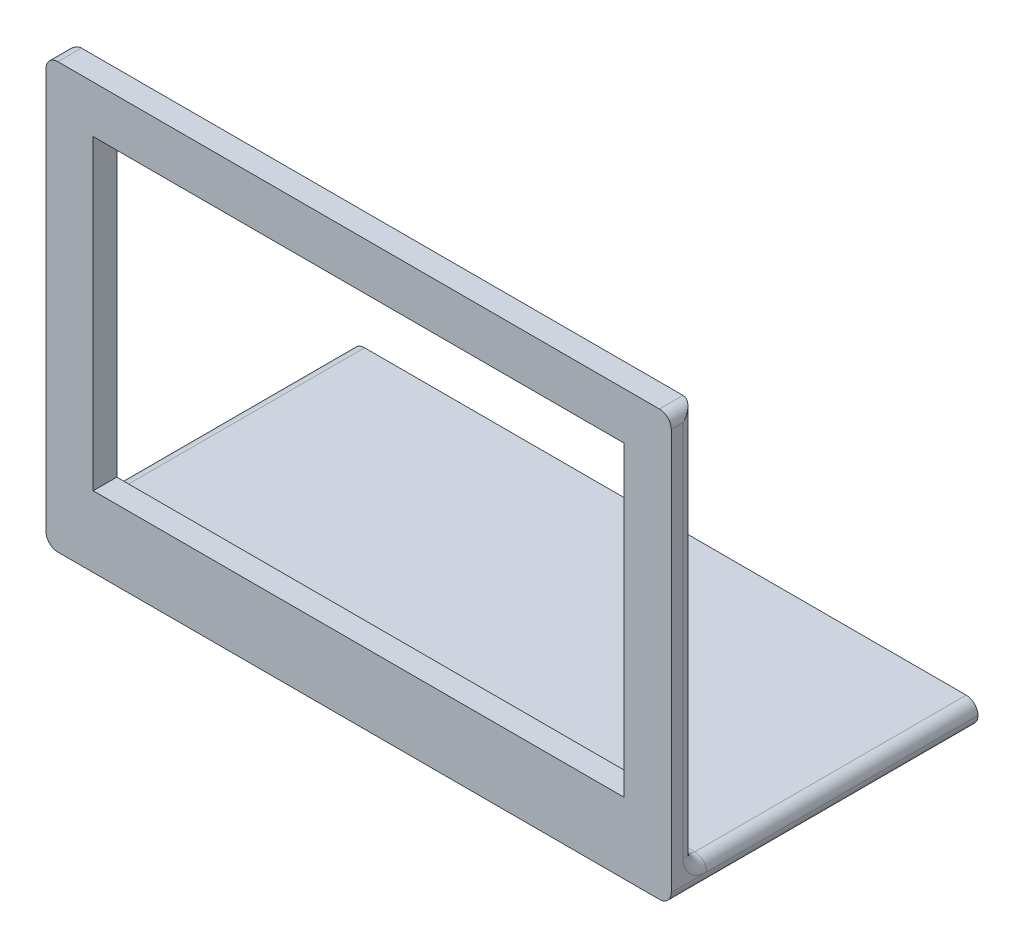
ISO-10303-21;
HEADER;
FILE_DESCRIPTION(('STEP AP214'),'2;1');
FILE_NAME('part.step','',(''),(''),'','','');
FILE_SCHEMA(('AUTOMOTIVE_DESIGN { 1 0 10303 214 1 1 1 1 }'));
ENDSEC;
DATA;
#1=APPLICATION_CONTEXT('core data for automotive mechanical design processes');
#2=APPLICATION_PROTOCOL_DEFINITION('international standard','automotive_design',2000,#1);
#3=PRODUCT_CONTEXT('',#1,'mechanical');
#4=PRODUCT('Part','Part','',(#3));
#5=PRODUCT_RELATED_PRODUCT_CATEGORY('part','',(#4));
#6=PRODUCT_DEFINITION_FORMATION('','',#4);
#7=PRODUCT_DEFINITION_CONTEXT('part definition',#1,'design');
#8=PRODUCT_DEFINITION('design','',#6,#7);
#9=PRODUCT_DEFINITION_SHAPE('','',#8);
#10=(LENGTH_UNIT() NAMED_UNIT(*) SI_UNIT(.MILLI.,.METRE.));
#11=(NAMED_UNIT(*) PLANE_ANGLE_UNIT() SI_UNIT($,.RADIAN.));
#12=(NAMED_UNIT(*) SI_UNIT($,.STERADIAN.) SOLID_ANGLE_UNIT());
#13=UNCERTAINTY_MEASURE_WITH_UNIT(LENGTH_MEASURE(1.E-05),#10,'distance_accuracy_value','');
#14=(GEOMETRIC_REPRESENTATION_CONTEXT(3) GLOBAL_UNCERTAINTY_ASSIGNED_CONTEXT((#13)) GLOBAL_UNIT_ASSIGNED_CONTEXT((#10,
#11,#12)) REPRESENTATION_CONTEXT('',''));
#15=CARTESIAN_POINT('',(0.,0.,0.));
#16=DIRECTION('',(0.,0.,1.));
#17=DIRECTION('',(1.,0.,0.));
#18=AXIS2_PLACEMENT_3D('',#15,#16,#17);
#19=CARTESIAN_POINT('',(0.,0.,0.));
#20=DIRECTION('',(0.,0.,1.));
#21=DIRECTION('',(1.,0.,0.));
#22=AXIS2_PLACEMENT_3D('',#19,#20,#21);
#23=PLANE('',#22);
#24=DIRECTION('',(1.,0.,0.));
#25=VECTOR('',#24,1.);
#26=CARTESIAN_POINT('',(0.,46.8354292599289,0.));
#27=LINE('',#26,#25);
#28=CARTESIAN_POINT('',(-24.7836869346876,46.8354292599289,0.));
#29=VERTEX_POINT('',#28);
#30=CARTESIAN_POINT('',(20.2163130653124,46.8354292599289,0.));
#31=VERTEX_POINT('',#30);
#32=EDGE_CURVE('E182',#29,#31,#27,.T.);
#33=ORIENTED_EDGE('',*,*,#32,.F.);
#34=DIRECTION('',(0.,-1.,0.));
#35=VECTOR('',#34,1.);
#36=CARTESIAN_POINT('',(-24.7836869346877,0.,0.));
#37=LINE('',#36,#35);
#38=CARTESIAN_POINT('',(-24.7836869346876,20.8354292599289,0.));
#39=VERTEX_POINT('',#38);
#40=EDGE_CURVE('E286',#29,#39,#37,.T.);
#41=ORIENTED_EDGE('',*,*,#40,.T.);
#42=DIRECTION('',(1.,0.,0.));
#43=VECTOR('',#42,1.);
#44=CARTESIAN_POINT('',(0.,20.8354292599289,0.));
#45=LINE('',#44,#43);
#46=CARTESIAN_POINT('',(20.2163130653124,20.8354292599289,0.));
#47=VERTEX_POINT('',#46);
#48=EDGE_CURVE('E301',#39,#47,#45,.T.);
#49=ORIENTED_EDGE('',*,*,#48,.T.);
#50=DIRECTION('',(0.,-1.,0.));
#51=VECTOR('',#50,1.);
#52=CARTESIAN_POINT('',(20.2163130653124,0.,0.));
#53=LINE('',#52,#51);
#54=EDGE_CURVE('E299',#31,#47,#53,.T.);
#55=ORIENTED_EDGE('',*,*,#54,.F.);
#56=EDGE_LOOP('',(#33,#41,#49,#55));
#57=FACE_BOUND('',#56,.T.);
#58=DIRECTION('',(1.,0.,0.));
#59=VECTOR('',#58,1.);
#60=CARTESIAN_POINT('',(-28.7836869346876,17.8354292599289,0.));
#61=LINE('',#60,#59);
#62=CARTESIAN_POINT('',(23.2163130653124,17.8354292599289,0.));
#63=VERTEX_POINT('',#62);
#64=CARTESIAN_POINT('',(-27.7836869346876,17.8354292599289,0.));
#65=VERTEX_POINT('',#64);
#66=EDGE_CURVE('E183',#63,#65,#61,.F.);
#67=ORIENTED_EDGE('',*,*,#66,.T.);
#68=DIRECTION('',(0.,1.,0.));
#69=VECTOR('',#68,1.);
#70=CARTESIAN_POINT('',(-27.7836869346876,50.8354292599289,0.));
#71=LINE('',#70,#69);
#72=CARTESIAN_POINT('',(-27.7836869346876,50.8354292599289,0.));
#73=VERTEX_POINT('',#72);
#74=EDGE_CURVE('E192',#65,#73,#71,.T.);
#75=ORIENTED_EDGE('',*,*,#74,.T.);
#76=DIRECTION('',(1.,0.,0.));
#77=VECTOR('',#76,1.);
#78=CARTESIAN_POINT('',(0.,50.8354292599289,0.));
#79=LINE('',#78,#77);
#80=CARTESIAN_POINT('',(23.2163130653127,50.8354292599289,0.));
#81=VERTEX_POINT('',#80);
#82=EDGE_CURVE('E279',#73,#81,#79,.T.);
#83=ORIENTED_EDGE('',*,*,#82,.T.);
#84=DIRECTION('',(0.,-1.,0.));
#85=VECTOR('',#84,1.);
#86=CARTESIAN_POINT('',(23.2163130653124,16.8354292599289,0.));
#87=LINE('',#86,#85);
#88=EDGE_CURVE('E185',#81,#63,#87,.T.);
#89=ORIENTED_EDGE('',*,*,#88,.T.);
#90=EDGE_LOOP('',(#67,#75,#83,#89));
#91=FACE_BOUND('',#90,.T.);
#92=ADVANCED_FACE('F37',(#57,#91),#23,.F.);
#93=CARTESIAN_POINT('',(0.,46.8354292599289,2.));
#94=DIRECTION('',(0.,1.,0.));
#95=DIRECTION('',(0.,0.,1.));
#96=AXIS2_PLACEMENT_3D('',#93,#94,#95);
#97=PLANE('',#96);
#98=ORIENTED_EDGE('',*,*,#32,.T.);
#99=DIRECTION('',(0.,0.,-1.));
#100=VECTOR('',#99,1.);
#101=CARTESIAN_POINT('',(20.2163130653124,46.8354292599289,2.));
#102=LINE('',#101,#100);
#103=CARTESIAN_POINT('',(20.2163130653124,46.8354292599289,2.));
#104=VERTEX_POINT('',#103);
#105=EDGE_CURVE('E163',#104,#31,#102,.T.);
#106=ORIENTED_EDGE('',*,*,#105,.F.);
#107=DIRECTION('',(1.,0.,0.));
#108=VECTOR('',#107,1.);
#109=CARTESIAN_POINT('',(0.,46.8354292599289,2.));
#110=LINE('',#109,#108);
#111=CARTESIAN_POINT('',(-24.7836869346876,46.8354292599289,2.));
#112=VERTEX_POINT('',#111);
#113=EDGE_CURVE('E170',#112,#104,#110,.T.);
#114=ORIENTED_EDGE('',*,*,#113,.F.);
#115=DIRECTION('',(0.,0.,-1.));
#116=VECTOR('',#115,1.);
#117=CARTESIAN_POINT('',(-24.7836869346876,46.8354292599289,2.));
#118=LINE('',#117,#116);
#119=EDGE_CURVE('E295',#112,#29,#118,.T.);
#120=ORIENTED_EDGE('',*,*,#119,.T.);
#121=EDGE_LOOP('',(#98,#106,#114,#120));
#122=FACE_BOUND('',#121,.T.);
#123=ADVANCED_FACE('F180',(#122),#97,.F.);
#124=CARTESIAN_POINT('',(20.2163130653124,0.,2.));
#125=DIRECTION('',(1.,0.,0.));
#126=DIRECTION('',(0.,0.,-1.));
#127=AXIS2_PLACEMENT_3D('',#124,#125,#126);
#128=PLANE('',#127);
#129=ORIENTED_EDGE('',*,*,#54,.T.);
#130=DIRECTION('',(0.,0.,-1.));
#131=VECTOR('',#130,1.);
#132=CARTESIAN_POINT('',(20.2163130653124,20.8354292599289,2.));
#133=LINE('',#132,#131);
#134=CARTESIAN_POINT('',(20.2163130653124,20.8354292599289,2.));
#135=VERTEX_POINT('',#134);
#136=EDGE_CURVE('E165',#135,#47,#133,.T.);
#137=ORIENTED_EDGE('',*,*,#136,.F.);
#138=DIRECTION('',(0.,-1.,0.));
#139=VECTOR('',#138,1.);
#140=CARTESIAN_POINT('',(20.2163130653124,0.,2.));
#141=LINE('',#140,#139);
#142=EDGE_CURVE('E158',#104,#135,#141,.T.);
#143=ORIENTED_EDGE('',*,*,#142,.F.);
#144=ORIENTED_EDGE('',*,*,#105,.T.);
#145=EDGE_LOOP('',(#129,#137,#143,#144));
#146=FACE_BOUND('',#145,.T.);
#147=ADVANCED_FACE('F161',(#146),#128,.F.);
#148=CARTESIAN_POINT('',(0.,20.8354292599289,2.));
#149=DIRECTION('',(0.,1.,0.));
#150=DIRECTION('',(0.,0.,1.));
#151=AXIS2_PLACEMENT_3D('',#148,#149,#150);
#152=PLANE('',#151);
#153=ORIENTED_EDGE('',*,*,#48,.F.);
#154=DIRECTION('',(0.,0.,-1.));
#155=VECTOR('',#154,1.);
#156=CARTESIAN_POINT('',(-24.7836869346876,20.8354292599289,2.));
#157=LINE('',#156,#155);
#158=CARTESIAN_POINT('',(-24.7836869346876,20.8354292599289,2.));
#159=VERTEX_POINT('',#158);
#160=EDGE_CURVE('E187',#159,#39,#157,.T.);
#161=ORIENTED_EDGE('',*,*,#160,.F.);
#162=DIRECTION('',(1.,0.,0.));
#163=VECTOR('',#162,1.);
#164=CARTESIAN_POINT('',(0.,20.8354292599289,2.));
#165=LINE('',#164,#163);
#166=EDGE_CURVE('E169',#159,#135,#165,.T.);
#167=ORIENTED_EDGE('',*,*,#166,.T.);
#168=ORIENTED_EDGE('',*,*,#136,.T.);
#169=EDGE_LOOP('',(#153,#161,#167,#168));
#170=FACE_BOUND('',#169,.T.);
#171=ADVANCED_FACE('F311',(#170),#152,.T.);
#172=CARTESIAN_POINT('',(-28.7836869346877,0.,2.));
#173=DIRECTION('',(-1.,0.,0.));
#174=DIRECTION('',(0.,-1.,0.));
#175=AXIS2_PLACEMENT_3D('',#172,#173,#174);
#176=PLANE('',#175);
#177=DIRECTION('',(0.,1.,0.));
#178=VECTOR('',#177,1.);
#179=CARTESIAN_POINT('',(-28.7836869346877,0.,2.));
#180=LINE('',#179,#178);
#181=CARTESIAN_POINT('',(-28.7836869346876,15.8354292599289,2.));
#182=VERTEX_POINT('',#181);
#183=CARTESIAN_POINT('',(-28.7836869346876,49.8354292599289,2.));
#184=VERTEX_POINT('',#183);
#185=EDGE_CURVE('E282',#182,#184,#180,.T.);
#186=ORIENTED_EDGE('',*,*,#185,.T.);
#187=DIRECTION('',(0.,0.,-1.));
#188=VECTOR('',#187,1.);
#189=CARTESIAN_POINT('',(-28.7836869346876,49.8354292599289,2.));
#190=LINE('',#189,#188);
#191=CARTESIAN_POINT('',(-28.7836869346876,49.8354292599289,1.));
#192=VERTEX_POINT('',#191);
#193=EDGE_CURVE('E202',#184,#192,#190,.T.);
#194=ORIENTED_EDGE('',*,*,#193,.T.);
#195=DIRECTION('',(0.,1.,0.));
#196=VECTOR('',#195,1.);
#197=CARTESIAN_POINT('',(-28.7836869346876,16.8354292599289,1.));
#198=LINE('',#197,#196);
#199=CARTESIAN_POINT('',(-28.7836869346876,17.8354292599289,1.));
#200=VERTEX_POINT('',#199);
#201=EDGE_CURVE('E200',#192,#200,#198,.F.);
#202=ORIENTED_EDGE('',*,*,#201,.T.);
#203=CARTESIAN_POINT('',(-28.7836869346876,17.8354292599289,-1.));
#204=DIRECTION('',(-1.,0.,0.));
#205=DIRECTION('',(0.,-1.,0.));
#206=AXIS2_PLACEMENT_3D('',#203,#204,#205);
#207=CIRCLE('',#206,2.);
#208=CARTESIAN_POINT('',(-28.7836869346876,15.8354292599289,-1.));
#209=VERTEX_POINT('',#208);
#210=EDGE_CURVE('E197',#209,#200,#207,.T.);
#211=ORIENTED_EDGE('',*,*,#210,.F.);
#212=DIRECTION('',(0.,0.,-1.));
#213=VECTOR('',#212,1.);
#214=CARTESIAN_POINT('',(-28.7836869346876,15.8354292599289,2.));
#215=LINE('',#214,#213);
#216=EDGE_CURVE('E195',#209,#182,#215,.F.);
#217=ORIENTED_EDGE('',*,*,#216,.T.);
#218=EDGE_LOOP('',(#186,#194,#202,#211,#217));
#219=FACE_BOUND('',#218,.T.);
#220=ADVANCED_FACE('F367',(#219),#176,.T.);
#221=CARTESIAN_POINT('',(0.,14.8354292599289,2.));
#222=DIRECTION('',(0.,-1.,0.));
#223=DIRECTION('',(1.,0.,0.));
#224=AXIS2_PLACEMENT_3D('',#221,#222,#223);
#225=PLANE('',#224);
#226=DIRECTION('',(-1.,0.,0.));
#227=VECTOR('',#226,1.);
#228=CARTESIAN_POINT('',(0.,14.8354292599289,-24.));
#229=LINE('',#228,#227);
#230=CARTESIAN_POINT('',(23.2163130653124,14.8354292599289,-24.));
#231=VERTEX_POINT('',#230);
#232=CARTESIAN_POINT('',(-27.7836869346876,14.8354292599289,-24.));
#233=VERTEX_POINT('',#232);
#234=EDGE_CURVE('E268',#231,#233,#229,.T.);
#235=ORIENTED_EDGE('',*,*,#234,.F.);
#236=DIRECTION('',(0.,0.,-1.));
#237=VECTOR('',#236,1.);
#238=CARTESIAN_POINT('',(23.2163130653124,14.8354292599289,2.));
#239=LINE('',#238,#237);
#240=CARTESIAN_POINT('',(23.2163130653124,14.8354292599289,2.));
#241=VERTEX_POINT('',#240);
#242=EDGE_CURVE('E11',#231,#241,#239,.F.);
#243=ORIENTED_EDGE('',*,*,#242,.T.);
#244=DIRECTION('',(-1.,0.,0.));
#245=VECTOR('',#244,1.);
#246=CARTESIAN_POINT('',(0.,14.8354292599289,2.));
#247=LINE('',#246,#245);
#248=CARTESIAN_POINT('',(-27.7836869346876,14.8354292599289,2.));
#249=VERTEX_POINT('',#248);
#250=EDGE_CURVE('E285',#241,#249,#247,.T.);
#251=ORIENTED_EDGE('',*,*,#250,.T.);
#252=DIRECTION('',(0.,0.,-1.));
#253=VECTOR('',#252,1.);
#254=CARTESIAN_POINT('',(-27.7836869346876,14.8354292599289,2.));
#255=LINE('',#254,#253);
#256=EDGE_CURVE('E46',#249,#233,#255,.T.);
#257=ORIENTED_EDGE('',*,*,#256,.T.);
#258=EDGE_LOOP('',(#235,#243,#251,#257));
#259=FACE_BOUND('',#258,.T.);
#260=ADVANCED_FACE('F369',(#259),#225,.T.);
#261=CARTESIAN_POINT('',(24.2163130653122,-2.52051640656006E-13,2.));
#262=DIRECTION('',(1.,0.,0.));
#263=DIRECTION('',(0.,1.,0.));
#264=AXIS2_PLACEMENT_3D('',#261,#262,#263);
#265=PLANE('',#264);
#266=DIRECTION('',(0.,-1.,0.));
#267=VECTOR('',#266,1.);
#268=CARTESIAN_POINT('',(24.2163130653127,50.8354292599289,1.));
#269=LINE('',#268,#267);
#270=CARTESIAN_POINT('',(24.2163130653124,17.8354292599289,1.));
#271=VERTEX_POINT('',#270);
#272=CARTESIAN_POINT('',(24.2163130653127,49.8354292599289,1.));
#273=VERTEX_POINT('',#272);
#274=EDGE_CURVE('E209',#271,#273,#269,.F.);
#275=ORIENTED_EDGE('',*,*,#274,.T.);
#276=DIRECTION('',(0.,0.,-1.));
#277=VECTOR('',#276,1.);
#278=CARTESIAN_POINT('',(24.2163130653127,49.8354292599289,2.));
#279=LINE('',#278,#277);
#280=CARTESIAN_POINT('',(24.2163130653127,49.8354292599289,2.));
#281=VERTEX_POINT('',#280);
#282=EDGE_CURVE('E211',#273,#281,#279,.F.);
#283=ORIENTED_EDGE('',*,*,#282,.T.);
#284=DIRECTION('',(0.,-1.,0.));
#285=VECTOR('',#284,1.);
#286=CARTESIAN_POINT('',(24.2163130653122,-2.52051640656006E-13,2.));
#287=LINE('',#286,#285);
#288=CARTESIAN_POINT('',(24.2163130653124,15.8354292599289,2.));
#289=VERTEX_POINT('',#288);
#290=EDGE_CURVE('E288',#281,#289,#287,.T.);
#291=ORIENTED_EDGE('',*,*,#290,.T.);
#292=DIRECTION('',(0.,0.,-1.));
#293=VECTOR('',#292,1.);
#294=CARTESIAN_POINT('',(24.2163130653124,15.8354292599289,2.));
#295=LINE('',#294,#293);
#296=CARTESIAN_POINT('',(24.2163130653124,15.8354292599289,-1.));
#297=VERTEX_POINT('',#296);
#298=EDGE_CURVE('E204',#289,#297,#295,.T.);
#299=ORIENTED_EDGE('',*,*,#298,.T.);
#300=CARTESIAN_POINT('',(24.2163130653124,17.8354292599289,-1.));
#301=DIRECTION('',(1.,0.,0.));
#302=DIRECTION('',(0.,1.,0.));
#303=AXIS2_PLACEMENT_3D('',#300,#301,#302);
#304=CIRCLE('',#303,2.);
#305=EDGE_CURVE('E206',#271,#297,#304,.T.);
#306=ORIENTED_EDGE('',*,*,#305,.F.);
#307=EDGE_LOOP('',(#275,#283,#291,#299,#306));
#308=FACE_BOUND('',#307,.T.);
#309=ADVANCED_FACE('F375',(#308),#265,.T.);
#310=CARTESIAN_POINT('',(0.,50.8354292599289,2.));
#311=DIRECTION('',(0.,1.,0.));
#312=DIRECTION('',(0.,0.,1.));
#313=AXIS2_PLACEMENT_3D('',#310,#311,#312);
#314=PLANE('',#313);
#315=DIRECTION('',(1.,0.,0.));
#316=VECTOR('',#315,1.);
#317=CARTESIAN_POINT('',(0.,50.8354292599289,2.));
#318=LINE('',#317,#316);
#319=CARTESIAN_POINT('',(-27.7836869346876,50.8354292599289,2.));
#320=VERTEX_POINT('',#319);
#321=CARTESIAN_POINT('',(23.2163130653127,50.8354292599289,2.));
#322=VERTEX_POINT('',#321);
#323=EDGE_CURVE('E178',#320,#322,#318,.T.);
#324=ORIENTED_EDGE('',*,*,#323,.T.);
#325=DIRECTION('',(0.,0.,-1.));
#326=VECTOR('',#325,1.);
#327=CARTESIAN_POINT('',(23.2163130653127,50.8354292599289,2.));
#328=LINE('',#327,#326);
#329=EDGE_CURVE('E229',#322,#81,#328,.T.);
#330=ORIENTED_EDGE('',*,*,#329,.T.);
#331=ORIENTED_EDGE('',*,*,#82,.F.);
#332=DIRECTION('',(0.,0.,-1.));
#333=VECTOR('',#332,1.);
#334=CARTESIAN_POINT('',(-27.7836869346876,50.8354292599289,2.));
#335=LINE('',#334,#333);
#336=EDGE_CURVE('E227',#73,#320,#335,.F.);
#337=ORIENTED_EDGE('',*,*,#336,.T.);
#338=EDGE_LOOP('',(#324,#330,#331,#337));
#339=FACE_BOUND('',#338,.T.);
#340=ADVANCED_FACE('F339',(#339),#314,.T.);
#341=CARTESIAN_POINT('',(-24.7836869346877,0.,2.));
#342=DIRECTION('',(1.,0.,0.));
#343=DIRECTION('',(0.,1.,0.));
#344=AXIS2_PLACEMENT_3D('',#341,#342,#343);
#345=PLANE('',#344);
#346=ORIENTED_EDGE('',*,*,#40,.F.);
#347=ORIENTED_EDGE('',*,*,#119,.F.);
#348=DIRECTION('',(0.,-1.,0.));
#349=VECTOR('',#348,1.);
#350=CARTESIAN_POINT('',(-24.7836869346877,0.,2.));
#351=LINE('',#350,#349);
#352=EDGE_CURVE('E176',#112,#159,#351,.T.);
#353=ORIENTED_EDGE('',*,*,#352,.T.);
#354=ORIENTED_EDGE('',*,*,#160,.T.);
#355=EDGE_LOOP('',(#346,#347,#353,#354));
#356=FACE_BOUND('',#355,.T.);
#357=ADVANCED_FACE('F309',(#356),#345,.T.);
#358=CARTESIAN_POINT('',(0.,0.,2.));
#359=DIRECTION('',(0.,0.,1.));
#360=DIRECTION('',(1.,0.,0.));
#361=AXIS2_PLACEMENT_3D('',#358,#359,#360);
#362=PLANE('',#361);
#363=ORIENTED_EDGE('',*,*,#290,.F.);
#364=CARTESIAN_POINT('',(23.2163130653127,49.8354292599289,2.));
#365=DIRECTION('',(0.,0.,1.));
#366=DIRECTION('',(1.,0.,0.));
#367=AXIS2_PLACEMENT_3D('',#364,#365,#366);
#368=CIRCLE('',#367,1.);
#369=EDGE_CURVE('E236',#281,#322,#368,.T.);
#370=ORIENTED_EDGE('',*,*,#369,.T.);
#371=ORIENTED_EDGE('',*,*,#323,.F.);
#372=CARTESIAN_POINT('',(-27.7836869346876,49.8354292599289,2.));
#373=DIRECTION('',(0.,0.,1.));
#374=DIRECTION('',(1.,0.,0.));
#375=AXIS2_PLACEMENT_3D('',#372,#373,#374);
#376=CIRCLE('',#375,1.);
#377=EDGE_CURVE('E232',#320,#184,#376,.T.);
#378=ORIENTED_EDGE('',*,*,#377,.T.);
#379=ORIENTED_EDGE('',*,*,#185,.F.);
#380=CARTESIAN_POINT('',(-27.7836869346876,15.8354292599289,2.));
#381=DIRECTION('',(0.,0.,1.));
#382=DIRECTION('',(1.,0.,0.));
#383=AXIS2_PLACEMENT_3D('',#380,#381,#382);
#384=CIRCLE('',#383,1.);
#385=EDGE_CURVE('E54',#182,#249,#384,.T.);
#386=ORIENTED_EDGE('',*,*,#385,.T.);
#387=ORIENTED_EDGE('',*,*,#250,.F.);
#388=CARTESIAN_POINT('',(23.2163130653124,15.8354292599289,2.));
#389=DIRECTION('',(0.,0.,1.));
#390=DIRECTION('',(1.,0.,0.));
#391=AXIS2_PLACEMENT_3D('',#388,#389,#390);
#392=CIRCLE('',#391,1.);
#393=EDGE_CURVE('E234',#241,#289,#392,.T.);
#394=ORIENTED_EDGE('',*,*,#393,.T.);
#395=EDGE_LOOP('',(#363,#370,#371,#378,#379,#386,#387,#394));
#396=FACE_BOUND('',#395,.T.);
#397=ORIENTED_EDGE('',*,*,#113,.T.);
#398=ORIENTED_EDGE('',*,*,#142,.T.);
#399=ORIENTED_EDGE('',*,*,#166,.F.);
#400=ORIENTED_EDGE('',*,*,#352,.F.);
#401=EDGE_LOOP('',(#397,#398,#399,#400));
#402=FACE_BOUND('',#401,.T.);
#403=ADVANCED_FACE('F174',(#396,#402),#362,.T.);
#404=CARTESIAN_POINT('',(0.,16.8354292599289,-24.));
#405=DIRECTION('',(0.,-1.,0.));
#406=DIRECTION('',(0.,0.,-1.));
#407=AXIS2_PLACEMENT_3D('',#404,#405,#406);
#408=PLANE('',#407);
#409=DIRECTION('',(1.,0.,0.));
#410=VECTOR('',#409,1.);
#411=CARTESIAN_POINT('',(0.,16.8354292599289,-24.));
#412=LINE('',#411,#410);
#413=CARTESIAN_POINT('',(-27.7836869346876,16.8354292599289,-24.));
#414=VERTEX_POINT('',#413);
#415=CARTESIAN_POINT('',(23.2163130653124,16.8354292599289,-24.));
#416=VERTEX_POINT('',#415);
#417=EDGE_CURVE('E274',#414,#416,#412,.T.);
#418=ORIENTED_EDGE('',*,*,#417,.F.);
#419=DIRECTION('',(0.,0.,1.));
#420=VECTOR('',#419,1.);
#421=CARTESIAN_POINT('',(-27.7836869346876,16.8354292599289,0.));
#422=LINE('',#421,#420);
#423=CARTESIAN_POINT('',(-27.7836869346876,16.8354292599289,-1.));
#424=VERTEX_POINT('',#423);
#425=EDGE_CURVE('E217',#414,#424,#422,.T.);
#426=ORIENTED_EDGE('',*,*,#425,.T.);
#427=DIRECTION('',(1.,0.,0.));
#428=VECTOR('',#427,1.);
#429=CARTESIAN_POINT('',(24.2163130653124,16.8354292599289,-1.));
#430=LINE('',#429,#428);
#431=CARTESIAN_POINT('',(23.2163130653124,16.8354292599289,-1.));
#432=VERTEX_POINT('',#431);
#433=EDGE_CURVE('E215',#424,#432,#430,.T.);
#434=ORIENTED_EDGE('',*,*,#433,.T.);
#435=DIRECTION('',(0.,0.,1.));
#436=VECTOR('',#435,1.);
#437=CARTESIAN_POINT('',(23.2163130653124,16.8354292599289,-24.));
#438=LINE('',#437,#436);
#439=EDGE_CURVE('E213',#432,#416,#438,.F.);
#440=ORIENTED_EDGE('',*,*,#439,.T.);
#441=EDGE_LOOP('',(#418,#426,#434,#440));
#442=FACE_BOUND('',#441,.T.);
#443=ADVANCED_FACE('F354',(#442),#408,.F.);
#444=CARTESIAN_POINT('',(0.,0.,-24.));
#445=DIRECTION('',(0.,0.,1.));
#446=DIRECTION('',(1.,0.,0.));
#447=AXIS2_PLACEMENT_3D('',#444,#445,#446);
#448=PLANE('',#447);
#449=ORIENTED_EDGE('',*,*,#417,.T.);
#450=CARTESIAN_POINT('',(23.2163130653124,15.8354292599289,-24.));
#451=DIRECTION('',(0.,0.,1.));
#452=DIRECTION('',(1.,0.,0.));
#453=AXIS2_PLACEMENT_3D('',#450,#451,#452);
#454=CIRCLE('',#453,1.);
#455=CARTESIAN_POINT('',(24.2163130653124,15.8354292599289,-24.));
#456=VERTEX_POINT('',#455);
#457=EDGE_CURVE('E225',#416,#456,#454,.F.);
#458=ORIENTED_EDGE('',*,*,#457,.T.);
#459=CARTESIAN_POINT('',(23.2163130653124,15.8354292599289,-24.));
#460=DIRECTION('',(0.,0.,1.));
#461=DIRECTION('',(1.,0.,0.));
#462=AXIS2_PLACEMENT_3D('',#459,#460,#461);
#463=CIRCLE('',#462,1.);
#464=EDGE_CURVE('E223',#456,#231,#463,.F.);
#465=ORIENTED_EDGE('',*,*,#464,.T.);
#466=ORIENTED_EDGE('',*,*,#234,.T.);
#467=CARTESIAN_POINT('',(-27.7836869346876,15.8354292599289,-24.));
#468=DIRECTION('',(0.,0.,1.));
#469=DIRECTION('',(1.,0.,0.));
#470=AXIS2_PLACEMENT_3D('',#467,#468,#469);
#471=CIRCLE('',#470,1.);
#472=CARTESIAN_POINT('',(-28.7836869346876,15.8354292599289,-24.));
#473=VERTEX_POINT('',#472);
#474=EDGE_CURVE('E219',#233,#473,#471,.F.);
#475=ORIENTED_EDGE('',*,*,#474,.T.);
#476=CARTESIAN_POINT('',(-27.7836869346876,15.8354292599289,-24.));
#477=DIRECTION('',(0.,0.,1.));
#478=DIRECTION('',(1.,0.,0.));
#479=AXIS2_PLACEMENT_3D('',#476,#477,#478);
#480=CIRCLE('',#479,1.);
#481=EDGE_CURVE('E221',#473,#414,#480,.F.);
#482=ORIENTED_EDGE('',*,*,#481,.T.);
#483=EDGE_LOOP('',(#449,#458,#465,#466,#475,#482));
#484=FACE_BOUND('',#483,.T.);
#485=ADVANCED_FACE('F356',(#484),#448,.F.);
#486=CARTESIAN_POINT('',(23.2163130653124,15.8354292599289,2.));
#487=DIRECTION('',(0.,0.,-1.));
#488=DIRECTION('',(-1.,0.,0.));
#489=AXIS2_PLACEMENT_3D('',#486,#487,#488);
#490=CYLINDRICAL_SURFACE('',#489,1.);
#491=ORIENTED_EDGE('',*,*,#242,.F.);
#492=ORIENTED_EDGE('',*,*,#464,.F.);
#493=DIRECTION('',(0.,0.,-1.));
#494=VECTOR('',#493,1.);
#495=CARTESIAN_POINT('',(24.2163130653124,15.8354292599289,2.));
#496=LINE('',#495,#494);
#497=EDGE_CURVE('E41',#297,#456,#496,.T.);
#498=ORIENTED_EDGE('',*,*,#497,.F.);
#499=ORIENTED_EDGE('',*,*,#298,.F.);
#500=ORIENTED_EDGE('',*,*,#393,.F.);
#501=EDGE_LOOP('',(#491,#492,#498,#499,#500));
#502=FACE_BOUND('',#501,.T.);
#503=ADVANCED_FACE('F39',(#502),#490,.T.);
#504=CARTESIAN_POINT('',(23.2163130653127,49.8354292599289,2.));
#505=DIRECTION('',(0.,0.,-1.));
#506=DIRECTION('',(-1.,0.,0.));
#507=AXIS2_PLACEMENT_3D('',#504,#505,#506);
#508=CYLINDRICAL_SURFACE('',#507,1.);
#509=ORIENTED_EDGE('',*,*,#369,.F.);
#510=ORIENTED_EDGE('',*,*,#282,.F.);
#511=CARTESIAN_POINT('',(23.2163130653127,49.8354292599289,1.));
#512=DIRECTION('',(0.,-0.707106781186547,-0.707106781186547));
#513=DIRECTION('',(0.,0.707106781186547,-0.707106781186547));
#514=AXIS2_PLACEMENT_3D('',#511,#512,#513);
#515=ELLIPSE('',#514,1.41421356237309,1.);
#516=EDGE_CURVE('E261',#81,#273,#515,.T.);
#517=ORIENTED_EDGE('',*,*,#516,.F.);
#518=ORIENTED_EDGE('',*,*,#329,.F.);
#519=EDGE_LOOP('',(#509,#510,#517,#518));
#520=FACE_BOUND('',#519,.T.);
#521=ADVANCED_FACE('F345',(#520),#508,.T.);
#522=CARTESIAN_POINT('',(23.2163130653124,15.8354292599289,2.));
#523=DIRECTION('',(0.,0.,-1.));
#524=DIRECTION('',(-1.,0.,0.));
#525=AXIS2_PLACEMENT_3D('',#522,#523,#524);
#526=CYLINDRICAL_SURFACE('',#525,1.);
#527=ORIENTED_EDGE('',*,*,#457,.F.);
#528=ORIENTED_EDGE('',*,*,#439,.F.);
#529=CARTESIAN_POINT('',(23.2163130653124,15.8354292599289,-1.));
#530=DIRECTION('',(0.,0.,1.));
#531=DIRECTION('',(1.,0.,0.));
#532=AXIS2_PLACEMENT_3D('',#529,#530,#531);
#533=CIRCLE('',#532,1.);
#534=EDGE_CURVE('E259',#297,#432,#533,.T.);
#535=ORIENTED_EDGE('',*,*,#534,.F.);
#536=ORIENTED_EDGE('',*,*,#497,.T.);
#537=EDGE_LOOP('',(#527,#528,#535,#536));
#538=FACE_BOUND('',#537,.T.);
#539=ADVANCED_FACE('F351',(#538),#526,.T.);
#540=CARTESIAN_POINT('',(23.2163130653122,-2.41643299800146E-13,1.));
#541=DIRECTION('',(0.,1.,0.));
#542=DIRECTION('',(-1.,0.,0.));
#543=AXIS2_PLACEMENT_3D('',#540,#541,#542);
#544=CYLINDRICAL_SURFACE('',#543,1.);
#545=ORIENTED_EDGE('',*,*,#516,.T.);
#546=ORIENTED_EDGE('',*,*,#274,.F.);
#547=CARTESIAN_POINT('',(23.2163130653124,17.8354292599289,1.));
#548=DIRECTION('',(0.,-1.,0.));
#549=DIRECTION('',(1.,0.,0.));
#550=AXIS2_PLACEMENT_3D('',#547,#548,#549);
#551=CIRCLE('',#550,1.);
#552=EDGE_CURVE('E256',#63,#271,#551,.T.);
#553=ORIENTED_EDGE('',*,*,#552,.F.);
#554=ORIENTED_EDGE('',*,*,#88,.F.);
#555=EDGE_LOOP('',(#545,#546,#553,#554));
#556=FACE_BOUND('',#555,.T.);
#557=ADVANCED_FACE('F346',(#556),#544,.T.);
#558=CARTESIAN_POINT('',(-27.7836869346876,15.8354292599289,2.));
#559=DIRECTION('',(0.,0.,-1.));
#560=DIRECTION('',(-1.,0.,0.));
#561=AXIS2_PLACEMENT_3D('',#558,#559,#560);
#562=CYLINDRICAL_SURFACE('',#561,1.);
#563=ORIENTED_EDGE('',*,*,#385,.F.);
#564=ORIENTED_EDGE('',*,*,#216,.F.);
#565=DIRECTION('',(0.,0.,-1.));
#566=VECTOR('',#565,1.);
#567=CARTESIAN_POINT('',(-28.7836869346876,15.8354292599289,2.));
#568=LINE('',#567,#566);
#569=EDGE_CURVE('E253',#473,#209,#568,.F.);
#570=ORIENTED_EDGE('',*,*,#569,.F.);
#571=ORIENTED_EDGE('',*,*,#474,.F.);
#572=ORIENTED_EDGE('',*,*,#256,.F.);
#573=EDGE_LOOP('',(#563,#564,#570,#571,#572));
#574=FACE_BOUND('',#573,.T.);
#575=ADVANCED_FACE('F364',(#574),#562,.T.);
#576=CARTESIAN_POINT('',(23.2163130653124,17.8354292599289,-1.));
#577=DIRECTION('',(1.,0.,0.));
#578=DIRECTION('',(0.,1.,0.));
#579=AXIS2_PLACEMENT_3D('',#576,#577,#578);
#580=TOROIDAL_SURFACE('',#579,2.,1.);
#581=ORIENTED_EDGE('',*,*,#305,.T.);
#582=ORIENTED_EDGE('',*,*,#534,.T.);
#583=CARTESIAN_POINT('',(23.2163130653124,17.8354292599289,-1.));
#584=DIRECTION('',(1.,0.,0.));
#585=DIRECTION('',(0.,1.,0.));
#586=AXIS2_PLACEMENT_3D('',#583,#584,#585);
#587=CIRCLE('',#586,1.);
#588=EDGE_CURVE('E250',#63,#432,#587,.T.);
#589=ORIENTED_EDGE('',*,*,#588,.F.);
#590=ORIENTED_EDGE('',*,*,#552,.T.);
#591=EDGE_LOOP('',(#581,#582,#589,#590));
#592=FACE_BOUND('',#591,.T.);
#593=ADVANCED_FACE('F349',(#592),#580,.T.);
#594=CARTESIAN_POINT('',(-27.7836869346876,15.8354292599289,-24.));
#595=DIRECTION('',(0.,0.,-1.));
#596=DIRECTION('',(-1.,0.,0.));
#597=AXIS2_PLACEMENT_3D('',#594,#595,#596);
#598=CYLINDRICAL_SURFACE('',#597,1.);
#599=ORIENTED_EDGE('',*,*,#481,.F.);
#600=ORIENTED_EDGE('',*,*,#569,.T.);
#601=CARTESIAN_POINT('',(-27.7836869346876,15.8354292599289,-1.));
#602=DIRECTION('',(0.,0.,1.));
#603=DIRECTION('',(1.,0.,0.));
#604=AXIS2_PLACEMENT_3D('',#601,#602,#603);
#605=CIRCLE('',#604,1.);
#606=EDGE_CURVE('E247',#424,#209,#605,.T.);
#607=ORIENTED_EDGE('',*,*,#606,.F.);
#608=ORIENTED_EDGE('',*,*,#425,.F.);
#609=EDGE_LOOP('',(#599,#600,#607,#608));
#610=FACE_BOUND('',#609,.T.);
#611=ADVANCED_FACE('F361',(#610),#598,.T.);
#612=CARTESIAN_POINT('',(0.,17.8354292599289,-1.));
#613=DIRECTION('',(-1.,0.,0.));
#614=DIRECTION('',(0.,0.,1.));
#615=AXIS2_PLACEMENT_3D('',#612,#613,#614);
#616=CYLINDRICAL_SURFACE('',#615,1.);
#617=ORIENTED_EDGE('',*,*,#588,.T.);
#618=ORIENTED_EDGE('',*,*,#433,.F.);
#619=CARTESIAN_POINT('',(-27.7836869346876,17.8354292599289,-1.));
#620=DIRECTION('',(-1.,0.,0.));
#621=DIRECTION('',(0.,-1.,0.));
#622=AXIS2_PLACEMENT_3D('',#619,#620,#621);
#623=CIRCLE('',#622,1.);
#624=EDGE_CURVE('E244',#65,#424,#623,.F.);
#625=ORIENTED_EDGE('',*,*,#624,.F.);
#626=ORIENTED_EDGE('',*,*,#66,.F.);
#627=EDGE_LOOP('',(#617,#618,#625,#626));
#628=FACE_BOUND('',#627,.T.);
#629=ADVANCED_FACE('F324',(#628),#616,.F.);
#630=CARTESIAN_POINT('',(-27.7836869346876,17.8354292599289,-1.));
#631=DIRECTION('',(-1.,0.,0.));
#632=DIRECTION('',(0.,-1.,0.));
#633=AXIS2_PLACEMENT_3D('',#630,#631,#632);
#634=TOROIDAL_SURFACE('',#633,2.,1.);
#635=ORIENTED_EDGE('',*,*,#606,.T.);
#636=ORIENTED_EDGE('',*,*,#210,.T.);
#637=CARTESIAN_POINT('',(-27.7836869346876,17.8354292599289,1.));
#638=DIRECTION('',(0.,-1.,0.));
#639=DIRECTION('',(1.,0.,0.));
#640=AXIS2_PLACEMENT_3D('',#637,#638,#639);
#641=CIRCLE('',#640,1.);
#642=EDGE_CURVE('E241',#65,#200,#641,.F.);
#643=ORIENTED_EDGE('',*,*,#642,.F.);
#644=ORIENTED_EDGE('',*,*,#624,.T.);
#645=EDGE_LOOP('',(#635,#636,#643,#644));
#646=FACE_BOUND('',#645,.T.);
#647=ADVANCED_FACE('F327',(#646),#634,.T.);
#648=CARTESIAN_POINT('',(-27.7836869346876,49.8354292599289,2.));
#649=DIRECTION('',(0.,0.,-1.));
#650=DIRECTION('',(-1.,0.,0.));
#651=AXIS2_PLACEMENT_3D('',#648,#649,#650);
#652=CYLINDRICAL_SURFACE('',#651,1.);
#653=ORIENTED_EDGE('',*,*,#377,.F.);
#654=ORIENTED_EDGE('',*,*,#336,.F.);
#655=CARTESIAN_POINT('',(-27.7836869346876,49.8354292599289,1.));
#656=DIRECTION('',(0.,-0.707106781186547,-0.707106781186547));
#657=DIRECTION('',(0.,0.707106781186547,-0.707106781186547));
#658=AXIS2_PLACEMENT_3D('',#655,#656,#657);
#659=ELLIPSE('',#658,1.41421356237309,1.);
#660=EDGE_CURVE('E239',#192,#73,#659,.T.);
#661=ORIENTED_EDGE('',*,*,#660,.F.);
#662=ORIENTED_EDGE('',*,*,#193,.F.);
#663=EDGE_LOOP('',(#653,#654,#661,#662));
#664=FACE_BOUND('',#663,.T.);
#665=ADVANCED_FACE('F336',(#664),#652,.T.);
#666=CARTESIAN_POINT('',(-27.7836869346877,0.,1.));
#667=DIRECTION('',(0.,-1.,0.));
#668=DIRECTION('',(1.,0.,0.));
#669=AXIS2_PLACEMENT_3D('',#666,#667,#668);
#670=CYLINDRICAL_SURFACE('',#669,1.);
#671=ORIENTED_EDGE('',*,*,#642,.T.);
#672=ORIENTED_EDGE('',*,*,#201,.F.);
#673=ORIENTED_EDGE('',*,*,#660,.T.);
#674=ORIENTED_EDGE('',*,*,#74,.F.);
#675=EDGE_LOOP('',(#671,#672,#673,#674));
#676=FACE_BOUND('',#675,.T.);
#677=ADVANCED_FACE('F330',(#676),#670,.T.);
#678=CLOSED_SHELL('',(#92,#123,#147,#171,#220,#260,#309,#340,#357,#403,#443,#485,#503,#521,#539,
#557,#575,#593,#611,#629,#647,#665,#677));
#679=MANIFOLD_SOLID_BREP('B2',#678);
#680=ADVANCED_BREP_SHAPE_REPRESENTATION('',(#18,#679),#14);
#681=SHAPE_DEFINITION_REPRESENTATION(#9,#680);
ENDSEC;
END-ISO-10303-21;
